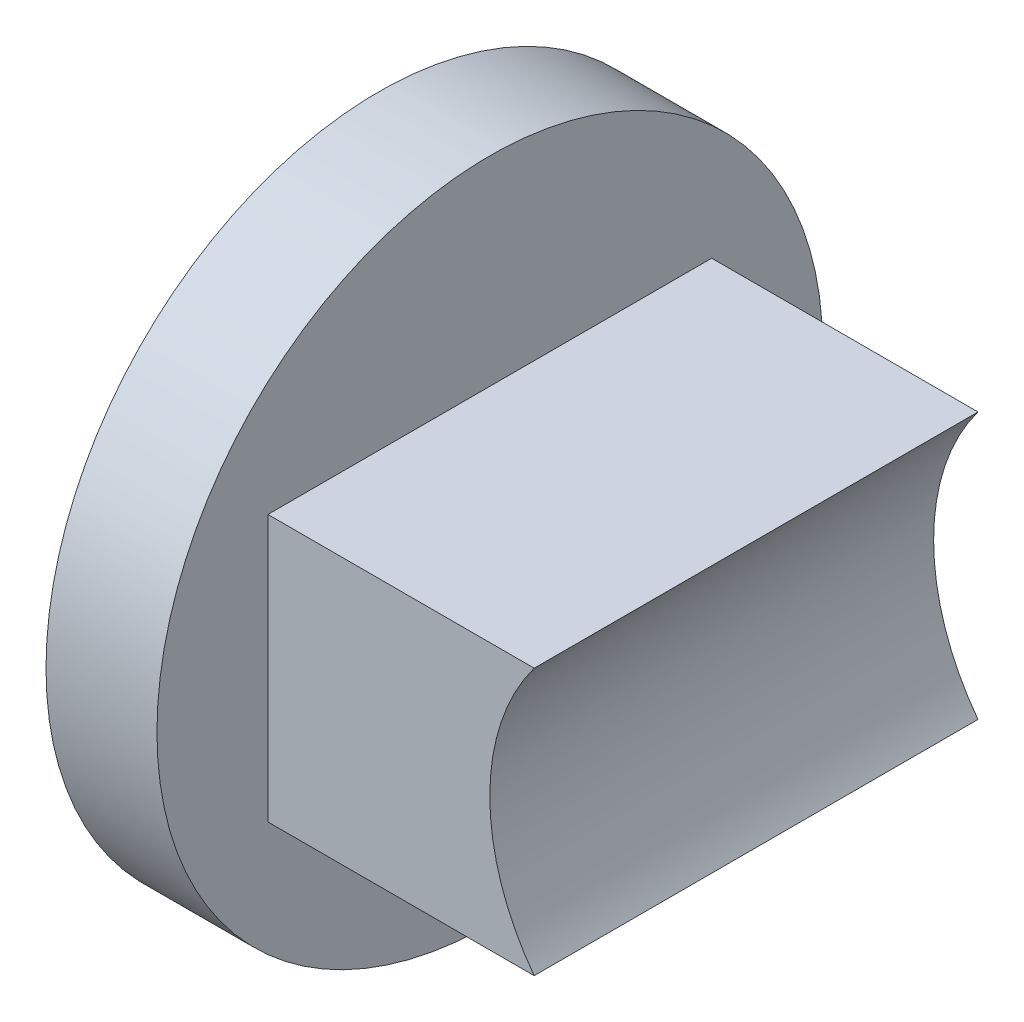
ISO-10303-21;
HEADER;
FILE_DESCRIPTION(('STEP AP214'),'2;1');
FILE_NAME('part.step','',(''),(''),'','','');
FILE_SCHEMA(('AUTOMOTIVE_DESIGN { 1 0 10303 214 1 1 1 1 }'));
ENDSEC;
DATA;
#1=APPLICATION_CONTEXT('core data for automotive mechanical design processes');
#2=APPLICATION_PROTOCOL_DEFINITION('international standard','automotive_design',2000,#1);
#3=PRODUCT_CONTEXT('',#1,'mechanical');
#4=PRODUCT('Part','Part','',(#3));
#5=PRODUCT_RELATED_PRODUCT_CATEGORY('part','',(#4));
#6=PRODUCT_DEFINITION_FORMATION('','',#4);
#7=PRODUCT_DEFINITION_CONTEXT('part definition',#1,'design');
#8=PRODUCT_DEFINITION('design','',#6,#7);
#9=PRODUCT_DEFINITION_SHAPE('','',#8);
#10=(LENGTH_UNIT() NAMED_UNIT(*) SI_UNIT(.MILLI.,.METRE.));
#11=(NAMED_UNIT(*) PLANE_ANGLE_UNIT() SI_UNIT($,.RADIAN.));
#12=(NAMED_UNIT(*) SI_UNIT($,.STERADIAN.) SOLID_ANGLE_UNIT());
#13=UNCERTAINTY_MEASURE_WITH_UNIT(LENGTH_MEASURE(1.E-05),#10,'distance_accuracy_value','');
#14=(GEOMETRIC_REPRESENTATION_CONTEXT(3) GLOBAL_UNCERTAINTY_ASSIGNED_CONTEXT((#13)) GLOBAL_UNIT_ASSIGNED_CONTEXT((#10,
#11,#12)) REPRESENTATION_CONTEXT('',''));
#15=CARTESIAN_POINT('',(0.,0.,0.));
#16=DIRECTION('',(0.,0.,1.));
#17=DIRECTION('',(1.,0.,0.));
#18=AXIS2_PLACEMENT_3D('',#15,#16,#17);
#19=CARTESIAN_POINT('',(10.,0.,0.));
#20=DIRECTION('',(1.,0.,0.));
#21=DIRECTION('',(0.,0.,-1.));
#22=AXIS2_PLACEMENT_3D('',#19,#20,#21);
#23=PLANE('',#22);
#24=DIRECTION('',(0.,-1.,0.));
#25=VECTOR('',#24,1.);
#26=CARTESIAN_POINT('',(10.,12.,20.));
#27=LINE('',#26,#25);
#28=CARTESIAN_POINT('',(10.,12.,20.));
#29=VERTEX_POINT('',#28);
#30=CARTESIAN_POINT('',(10.,-12.,20.));
#31=VERTEX_POINT('',#30);
#32=EDGE_CURVE('E94',#29,#31,#27,.T.);
#33=ORIENTED_EDGE('',*,*,#32,.F.);
#34=DIRECTION('',(0.,0.,1.));
#35=VECTOR('',#34,1.);
#36=CARTESIAN_POINT('',(10.,12.,20.));
#37=LINE('',#36,#35);
#38=CARTESIAN_POINT('',(10.,12.,-20.));
#39=VERTEX_POINT('',#38);
#40=EDGE_CURVE('E107',#39,#29,#37,.T.);
#41=ORIENTED_EDGE('',*,*,#40,.F.);
#42=DIRECTION('',(0.,1.,0.));
#43=VECTOR('',#42,1.);
#44=CARTESIAN_POINT('',(10.,12.,-20.));
#45=LINE('',#44,#43);
#46=CARTESIAN_POINT('',(10.,-12.,-20.));
#47=VERTEX_POINT('',#46);
#48=EDGE_CURVE('E99',#47,#39,#45,.T.);
#49=ORIENTED_EDGE('',*,*,#48,.F.);
#50=DIRECTION('',(0.,0.,-1.));
#51=VECTOR('',#50,1.);
#52=CARTESIAN_POINT('',(10.,-12.,20.));
#53=LINE('',#52,#51);
#54=EDGE_CURVE('E154',#31,#47,#53,.T.);
#55=ORIENTED_EDGE('',*,*,#54,.F.);
#56=EDGE_LOOP('',(#33,#41,#49,#55));
#57=FACE_BOUND('',#56,.T.);
#58=CARTESIAN_POINT('',(10.,0.,0.));
#59=DIRECTION('',(1.,0.,0.));
#60=DIRECTION('',(0.,0.,-1.));
#61=AXIS2_PLACEMENT_3D('',#58,#59,#60);
#62=CIRCLE('',#61,30.);
#63=CARTESIAN_POINT('',(10.,0.,-30.));
#64=VERTEX_POINT('',#63);
#65=EDGE_CURVE('E48',#64,#64,#62,.T.);
#66=ORIENTED_EDGE('',*,*,#65,.T.);
#67=EDGE_LOOP('',(#66));
#68=FACE_BOUND('',#67,.T.);
#69=ADVANCED_FACE('F39',(#57,#68),#23,.T.);
#70=CARTESIAN_POINT('',(0.,0.,0.));
#71=DIRECTION('',(1.,0.,0.));
#72=DIRECTION('',(0.,0.,-1.));
#73=AXIS2_PLACEMENT_3D('',#70,#71,#72);
#74=PLANE('',#73);
#75=CARTESIAN_POINT('',(0.,0.,0.));
#76=DIRECTION('',(1.,0.,0.));
#77=DIRECTION('',(0.,0.,-1.));
#78=AXIS2_PLACEMENT_3D('',#75,#76,#77);
#79=CIRCLE('',#78,30.);
#80=CARTESIAN_POINT('',(0.,0.,-30.));
#81=VERTEX_POINT('',#80);
#82=EDGE_CURVE('E121',#81,#81,#79,.T.);
#83=ORIENTED_EDGE('',*,*,#82,.F.);
#84=EDGE_LOOP('',(#83));
#85=FACE_BOUND('',#84,.T.);
#86=CARTESIAN_POINT('',(0.,0.,0.));
#87=DIRECTION('',(1.,0.,0.));
#88=DIRECTION('',(0.,0.,-1.));
#89=AXIS2_PLACEMENT_3D('',#86,#87,#88);
#90=CIRCLE('',#89,5.);
#91=CARTESIAN_POINT('',(0.,0.,-5.));
#92=VERTEX_POINT('',#91);
#93=EDGE_CURVE('E117',#92,#92,#90,.T.);
#94=ORIENTED_EDGE('',*,*,#93,.T.);
#95=EDGE_LOOP('',(#94));
#96=FACE_BOUND('',#95,.T.);
#97=ADVANCED_FACE('F129',(#85,#96),#74,.F.);
#98=CARTESIAN_POINT('',(10.,0.,0.));
#99=DIRECTION('',(-1.,0.,0.));
#100=DIRECTION('',(0.,0.,1.));
#101=AXIS2_PLACEMENT_3D('',#98,#99,#100);
#102=CYLINDRICAL_SURFACE('',#101,30.);
#103=ORIENTED_EDGE('',*,*,#65,.F.);
#104=EDGE_LOOP('',(#103));
#105=FACE_BOUND('',#104,.T.);
#106=ORIENTED_EDGE('',*,*,#82,.T.);
#107=EDGE_LOOP('',(#106));
#108=FACE_BOUND('',#107,.T.);
#109=ADVANCED_FACE('F41',(#105,#108),#102,.T.);
#110=CARTESIAN_POINT('',(10.,0.,0.));
#111=DIRECTION('',(-1.,0.,0.));
#112=DIRECTION('',(0.,0.,1.));
#113=AXIS2_PLACEMENT_3D('',#110,#111,#112);
#114=CYLINDRICAL_SURFACE('',#113,5.);
#115=CARTESIAN_POINT('',(10.,0.,0.));
#116=DIRECTION('',(1.,0.,0.));
#117=DIRECTION('',(0.,0.,-1.));
#118=AXIS2_PLACEMENT_3D('',#115,#116,#117);
#119=CIRCLE('',#118,5.);
#120=CARTESIAN_POINT('',(10.,0.,-5.));
#121=VERTEX_POINT('',#120);
#122=EDGE_CURVE('E113',#121,#121,#119,.T.);
#123=ORIENTED_EDGE('',*,*,#122,.T.);
#124=EDGE_LOOP('',(#123));
#125=FACE_BOUND('',#124,.T.);
#126=ORIENTED_EDGE('',*,*,#93,.F.);
#127=EDGE_LOOP('',(#126));
#128=FACE_BOUND('',#127,.T.);
#129=ADVANCED_FACE('F134',(#125,#128),#114,.F.);
#130=CARTESIAN_POINT('',(40.,12.,20.));
#131=DIRECTION('',(0.,-1.,0.));
#132=DIRECTION('',(0.,0.,-1.));
#133=AXIS2_PLACEMENT_3D('',#130,#131,#132);
#134=PLANE('',#133);
#135=DIRECTION('',(-1.,0.,0.));
#136=VECTOR('',#135,1.);
#137=CARTESIAN_POINT('',(40.,12.,20.));
#138=LINE('',#137,#136);
#139=CARTESIAN_POINT('',(34.,12.,20.));
#140=VERTEX_POINT('',#139);
#141=EDGE_CURVE('E61',#140,#29,#138,.T.);
#142=ORIENTED_EDGE('',*,*,#141,.F.);
#143=DIRECTION('',(0.,0.,-1.));
#144=VECTOR('',#143,1.);
#145=CARTESIAN_POINT('',(34.,12.,30.));
#146=LINE('',#145,#144);
#147=CARTESIAN_POINT('',(34.,12.,-20.));
#148=VERTEX_POINT('',#147);
#149=EDGE_CURVE('E55',#140,#148,#146,.T.);
#150=ORIENTED_EDGE('',*,*,#149,.T.);
#151=DIRECTION('',(-1.,0.,0.));
#152=VECTOR('',#151,1.);
#153=CARTESIAN_POINT('',(40.,12.,-20.));
#154=LINE('',#153,#152);
#155=EDGE_CURVE('E91',#148,#39,#154,.T.);
#156=ORIENTED_EDGE('',*,*,#155,.T.);
#157=ORIENTED_EDGE('',*,*,#40,.T.);
#158=EDGE_LOOP('',(#142,#150,#156,#157));
#159=FACE_BOUND('',#158,.T.);
#160=ADVANCED_FACE('F89',(#159),#134,.F.);
#161=CARTESIAN_POINT('',(40.,12.,-20.));
#162=DIRECTION('',(0.,0.,1.));
#163=DIRECTION('',(1.,0.,0.));
#164=AXIS2_PLACEMENT_3D('',#161,#162,#163);
#165=PLANE('',#164);
#166=ORIENTED_EDGE('',*,*,#155,.F.);
#167=CARTESIAN_POINT('',(50.,0.,-20.));
#168=DIRECTION('',(0.,0.,-1.));
#169=DIRECTION('',(-1.,0.,0.));
#170=AXIS2_PLACEMENT_3D('',#167,#168,#169);
#171=CIRCLE('',#170,20.);
#172=CARTESIAN_POINT('',(34.,-12.,-20.));
#173=VERTEX_POINT('',#172);
#174=EDGE_CURVE('E79',#173,#148,#171,.T.);
#175=ORIENTED_EDGE('',*,*,#174,.F.);
#176=DIRECTION('',(-1.,0.,0.));
#177=VECTOR('',#176,1.);
#178=CARTESIAN_POINT('',(40.,-12.,-20.));
#179=LINE('',#178,#177);
#180=EDGE_CURVE('E101',#173,#47,#179,.T.);
#181=ORIENTED_EDGE('',*,*,#180,.T.);
#182=ORIENTED_EDGE('',*,*,#48,.T.);
#183=EDGE_LOOP('',(#166,#175,#181,#182));
#184=FACE_BOUND('',#183,.T.);
#185=ADVANCED_FACE('F97',(#184),#165,.F.);
#186=CARTESIAN_POINT('',(40.,-12.,20.));
#187=DIRECTION('',(0.,1.,0.));
#188=DIRECTION('',(0.,0.,1.));
#189=AXIS2_PLACEMENT_3D('',#186,#187,#188);
#190=PLANE('',#189);
#191=ORIENTED_EDGE('',*,*,#180,.F.);
#192=DIRECTION('',(0.,0.,-1.));
#193=VECTOR('',#192,1.);
#194=CARTESIAN_POINT('',(34.,-12.,30.));
#195=LINE('',#194,#193);
#196=CARTESIAN_POINT('',(34.,-12.,20.));
#197=VERTEX_POINT('',#196);
#198=EDGE_CURVE('E82',#173,#197,#195,.F.);
#199=ORIENTED_EDGE('',*,*,#198,.T.);
#200=DIRECTION('',(-1.,0.,0.));
#201=VECTOR('',#200,1.);
#202=CARTESIAN_POINT('',(40.,-12.,20.));
#203=LINE('',#202,#201);
#204=EDGE_CURVE('E105',#197,#31,#203,.T.);
#205=ORIENTED_EDGE('',*,*,#204,.T.);
#206=ORIENTED_EDGE('',*,*,#54,.T.);
#207=EDGE_LOOP('',(#191,#199,#205,#206));
#208=FACE_BOUND('',#207,.T.);
#209=ADVANCED_FACE('F166',(#208),#190,.F.);
#210=CARTESIAN_POINT('',(40.,12.,20.));
#211=DIRECTION('',(0.,0.,-1.));
#212=DIRECTION('',(0.,1.,0.));
#213=AXIS2_PLACEMENT_3D('',#210,#211,#212);
#214=PLANE('',#213);
#215=ORIENTED_EDGE('',*,*,#204,.F.);
#216=CARTESIAN_POINT('',(50.,0.,20.));
#217=DIRECTION('',(0.,0.,-1.));
#218=DIRECTION('',(0.,1.,0.));
#219=AXIS2_PLACEMENT_3D('',#216,#217,#218);
#220=CIRCLE('',#219,20.);
#221=EDGE_CURVE('E11',#197,#140,#220,.T.);
#222=ORIENTED_EDGE('',*,*,#221,.T.);
#223=ORIENTED_EDGE('',*,*,#141,.T.);
#224=ORIENTED_EDGE('',*,*,#32,.T.);
#225=EDGE_LOOP('',(#215,#222,#223,#224));
#226=FACE_BOUND('',#225,.T.);
#227=ADVANCED_FACE('F167',(#226),#214,.F.);
#228=CARTESIAN_POINT('',(10.,0.,0.));
#229=DIRECTION('',(1.,0.,0.));
#230=DIRECTION('',(0.,0.,-1.));
#231=AXIS2_PLACEMENT_3D('',#228,#229,#230);
#232=PLANE('',#231);
#233=ORIENTED_EDGE('',*,*,#122,.F.);
#234=EDGE_LOOP('',(#233));
#235=FACE_BOUND('',#234,.T.);
#236=ADVANCED_FACE('F169',(#235),#232,.F.);
#237=CARTESIAN_POINT('',(50.,0.,30.));
#238=DIRECTION('',(0.,0.,-1.));
#239=DIRECTION('',(-1.,0.,0.));
#240=AXIS2_PLACEMENT_3D('',#237,#238,#239);
#241=CYLINDRICAL_SURFACE('',#240,20.);
#242=ORIENTED_EDGE('',*,*,#221,.F.);
#243=ORIENTED_EDGE('',*,*,#198,.F.);
#244=ORIENTED_EDGE('',*,*,#174,.T.);
#245=ORIENTED_EDGE('',*,*,#149,.F.);
#246=EDGE_LOOP('',(#242,#243,#244,#245));
#247=FACE_BOUND('',#246,.T.);
#248=ADVANCED_FACE('F80',(#247),#241,.F.);
#249=CLOSED_SHELL('',(#69,#97,#109,#129,#160,#185,#209,#227,#236,#248));
#250=MANIFOLD_SOLID_BREP('B2',#249);
#251=ADVANCED_BREP_SHAPE_REPRESENTATION('',(#18,#250),#14);
#252=SHAPE_DEFINITION_REPRESENTATION(#9,#251);
ENDSEC;
END-ISO-10303-21;
